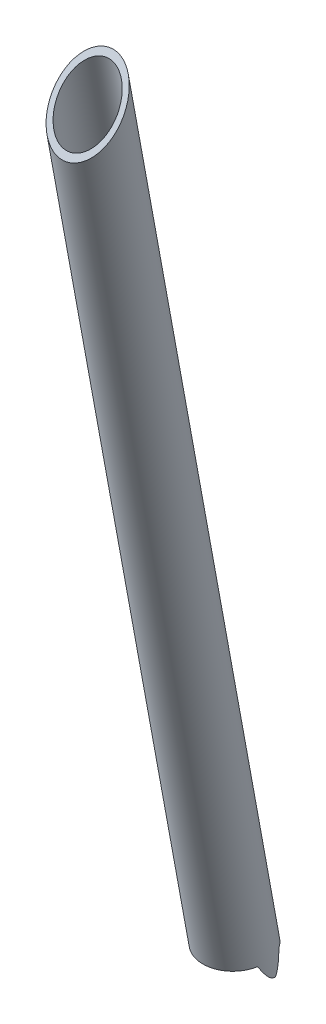
ISO-10303-21;
HEADER;
FILE_DESCRIPTION(('STEP AP214'),'2;1');
FILE_NAME('part.step','',(''),(''),'','','');
FILE_SCHEMA(('AUTOMOTIVE_DESIGN { 1 0 10303 214 1 1 1 1 }'));
ENDSEC;
DATA;
#1=APPLICATION_CONTEXT('core data for automotive mechanical design processes');
#2=APPLICATION_PROTOCOL_DEFINITION('international standard','automotive_design',2000,#1);
#3=PRODUCT_CONTEXT('',#1,'mechanical');
#4=PRODUCT('Part','Part','',(#3));
#5=PRODUCT_RELATED_PRODUCT_CATEGORY('part','',(#4));
#6=PRODUCT_DEFINITION_FORMATION('','',#4);
#7=PRODUCT_DEFINITION_CONTEXT('part definition',#1,'design');
#8=PRODUCT_DEFINITION('design','',#6,#7);
#9=PRODUCT_DEFINITION_SHAPE('','',#8);
#10=(LENGTH_UNIT() NAMED_UNIT(*) SI_UNIT(.MILLI.,.METRE.));
#11=(NAMED_UNIT(*) PLANE_ANGLE_UNIT() SI_UNIT($,.RADIAN.));
#12=(NAMED_UNIT(*) SI_UNIT($,.STERADIAN.) SOLID_ANGLE_UNIT());
#13=UNCERTAINTY_MEASURE_WITH_UNIT(LENGTH_MEASURE(1.E-05),#10,'distance_accuracy_value','');
#14=(GEOMETRIC_REPRESENTATION_CONTEXT(3) GLOBAL_UNCERTAINTY_ASSIGNED_CONTEXT((#13)) GLOBAL_UNIT_ASSIGNED_CONTEXT((#10,
#11,#12)) REPRESENTATION_CONTEXT('',''));
#15=CARTESIAN_POINT('',(0.,0.,0.));
#16=DIRECTION('',(0.,0.,1.));
#17=DIRECTION('',(1.,0.,0.));
#18=AXIS2_PLACEMENT_3D('',#15,#16,#17);
#19=CARTESIAN_POINT('',(325.,320.,-1580.));
#20=DIRECTION('',(-0.214351342090107,-0.914565726251124,-0.342962147344171));
#21=DIRECTION('',(0.,0.351123441588391,-0.936329177569045));
#22=AXIS2_PLACEMENT_3D('',#19,#20,#21);
#23=CYLINDRICAL_SURFACE('',#22,7.90000000000002);
#24=CARTESIAN_POINT('',(252.34375,10.,-1696.25));
#25=DIRECTION('',(0.,-1.,0.));
#26=DIRECTION('',(-0.52999894000318,0.,-0.847998304005088));
#27=AXIS2_PLACEMENT_3D('',#24,#25,#26);
#28=ELLIPSE('',#27,8.63797950572971,7.90000000000002);
#29=CARTESIAN_POINT('',(247.765630018194,10.,-1703.57499197089));
#30=VERTEX_POINT('',#29);
#31=EDGE_CURVE('E84',#30,#30,#28,.T.);
#32=ORIENTED_EDGE('',*,*,#31,.T.);
#33=EDGE_LOOP('',(#32));
#34=FACE_BOUND('',#33,.T.);
#35=CARTESIAN_POINT('',(325.,320.,-1580.));
#36=DIRECTION('',(0.00416950723616233,0.393939167319851,0.919127057408686));
#37=DIRECTION('',(-0.2871987901008,-0.87994037819309,0.37844654284329));
#38=AXIS2_PLACEMENT_3D('',#35,#36,#37);
#39=ELLIPSE('',#38,11.6794314327941,7.90000000000002);
#40=CARTESIAN_POINT('',(321.645681423436,309.722796687947,-1575.57995955188));
#41=VERTEX_POINT('',#40);
#42=EDGE_CURVE('E43',#41,#41,#39,.T.);
#43=ORIENTED_EDGE('',*,*,#42,.T.);
#44=EDGE_LOOP('',(#43));
#45=FACE_BOUND('',#44,.T.);
#46=ADVANCED_FACE('F39',(#34,#45),#23,.F.);
#47=CARTESIAN_POINT('',(325.,320.,-1580.));
#48=DIRECTION('',(-0.214351342090107,-0.914565726251124,-0.342962147344171));
#49=DIRECTION('',(0.,0.351123441588391,-0.936329177569045));
#50=AXIS2_PLACEMENT_3D('',#47,#48,#49);
#51=CYLINDRICAL_SURFACE('',#50,9.49999999999999);
#52=CARTESIAN_POINT('',(258.509137658845,36.3056540110711,-1686.38537974585));
#53=DIRECTION('',(-0.993532672656404,0.,-0.113546591160732));
#54=DIRECTION('',(0.03712393124551,-0.945042024116468,-0.324834398398211));
#55=AXIS2_PLACEMENT_3D('',#52,#53,#54);
#56=ELLIPSE('',#55,37.712293737374,9.49999999999999);
#57=CARTESIAN_POINT('',(260.240282329124,10.,-1701.53289561079));
#58=VERTEX_POINT('',#57);
#59=CARTESIAN_POINT('',(260.141225962762,3.01994811422281,-1700.66615240513));
#60=VERTEX_POINT('',#59);
#61=EDGE_CURVE('E78',#58,#60,#56,.T.);
#62=ORIENTED_EDGE('',*,*,#61,.F.);
#63=CARTESIAN_POINT('',(252.34375,10.,-1696.25));
#64=DIRECTION('',(0.,-1.,0.));
#65=DIRECTION('',(-0.52999894000318,0.,-0.847998304005088));
#66=AXIS2_PLACEMENT_3D('',#63,#64,#65);
#67=ELLIPSE('',#66,10.3874437094218,9.49999999999999);
#68=CARTESIAN_POINT('',(261.924194176926,10.,-1693.53427954847));
#69=VERTEX_POINT('',#68);
#70=EDGE_CURVE('E68',#69,#58,#67,.T.);
#71=ORIENTED_EDGE('',*,*,#70,.F.);
#72=CARTESIAN_POINT('',(267.179606773407,73.2996555665376,-1672.51262916255));
#73=DIRECTION('',(-0.970142500145332,0.,0.242535625036333));
#74=DIRECTION('',(-0.0940407512885348,-0.921768805422756,-0.376163005154139));
#75=AXIS2_PLACEMENT_3D('',#72,#73,#74);
#76=ELLIPSE('',#75,76.1396046117398,9.49999999999999);
#77=EDGE_CURVE('E48',#60,#69,#76,.T.);
#78=ORIENTED_EDGE('',*,*,#77,.F.);
#79=EDGE_LOOP('',(#62,#71,#78));
#80=FACE_BOUND('',#79,.T.);
#81=CARTESIAN_POINT('',(325.,320.,-1580.));
#82=DIRECTION('',(0.00416950723616233,0.393939167319851,0.919127057408686));
#83=DIRECTION('',(-0.2871987901008,-0.87994037819309,0.37844654284329));
#84=AXIS2_PLACEMENT_3D('',#81,#82,#83);
#85=ELLIPSE('',#84,14.0448859001954,9.49999999999999);
#86=CARTESIAN_POINT('',(320.96632576236,307.641337789304,-1574.68476148644));
#87=VERTEX_POINT('',#86);
#88=EDGE_CURVE('E11',#87,#87,#85,.T.);
#89=ORIENTED_EDGE('',*,*,#88,.F.);
#90=EDGE_LOOP('',(#89));
#91=FACE_BOUND('',#90,.T.);
#92=ADVANCED_FACE('F80',(#80,#91),#51,.T.);
#93=CARTESIAN_POINT('',(259.935326726564,10.,-1698.86453408839));
#94=DIRECTION('',(-0.993532672656404,0.,-0.113546591160732));
#95=DIRECTION('',(-0.113546591160732,0.,0.993532672656404));
#96=AXIS2_PLACEMENT_3D('',#93,#94,#95);
#97=PLANE('',#96);
#98=ORIENTED_EDGE('',*,*,#61,.T.);
#99=DIRECTION('',(0.,1.,0.));
#100=VECTOR('',#99,1.);
#101=CARTESIAN_POINT('',(260.141225962762,10.,-1700.66615240513));
#102=LINE('',#101,#100);
#103=CARTESIAN_POINT('',(260.141225962762,10.,-1700.66615240513));
#104=VERTEX_POINT('',#103);
#105=EDGE_CURVE('E56',#60,#104,#102,.T.);
#106=ORIENTED_EDGE('',*,*,#105,.T.);
#107=DIRECTION('',(-0.113546591160732,0.,0.993532672656404));
#108=VECTOR('',#107,1.);
#109=CARTESIAN_POINT('',(259.935326726564,10.,-1698.86453408839));
#110=LINE('',#109,#108);
#111=EDGE_CURVE('E71',#58,#104,#110,.T.);
#112=ORIENTED_EDGE('',*,*,#111,.F.);
#113=EDGE_LOOP('',(#98,#106,#112));
#114=FACE_BOUND('',#113,.T.);
#115=ADVANCED_FACE('F77',(#114),#97,.T.);
#116=CARTESIAN_POINT('',(259.935326726564,10.,-1698.86453408839));
#117=DIRECTION('',(0.,-1.,0.));
#118=DIRECTION('',(0.,0.,-1.));
#119=AXIS2_PLACEMENT_3D('',#116,#117,#118);
#120=PLANE('',#119);
#121=ORIENTED_EDGE('',*,*,#31,.F.);
#122=EDGE_LOOP('',(#121));
#123=FACE_BOUND('',#122,.T.);
#124=ORIENTED_EDGE('',*,*,#70,.T.);
#125=ORIENTED_EDGE('',*,*,#111,.T.);
#126=DIRECTION('',(0.242535625036333,0.,0.970142500145332));
#127=VECTOR('',#126,1.);
#128=CARTESIAN_POINT('',(184.701425001453,10.,-2002.42535625036));
#129=LINE('',#128,#127);
#130=EDGE_CURVE('E72',#104,#69,#129,.T.);
#131=ORIENTED_EDGE('',*,*,#130,.T.);
#132=EDGE_LOOP('',(#124,#125,#131));
#133=FACE_BOUND('',#132,.T.);
#134=ADVANCED_FACE('F70',(#123,#133),#120,.T.);
#135=CARTESIAN_POINT('',(184.701425001453,10.,-2002.42535625036));
#136=DIRECTION('',(-0.970142500145332,0.,0.242535625036333));
#137=DIRECTION('',(0.242535625036333,0.,0.970142500145332));
#138=AXIS2_PLACEMENT_3D('',#135,#136,#137);
#139=PLANE('',#138);
#140=ORIENTED_EDGE('',*,*,#77,.T.);
#141=ORIENTED_EDGE('',*,*,#130,.F.);
#142=ORIENTED_EDGE('',*,*,#105,.F.);
#143=EDGE_LOOP('',(#140,#141,#142));
#144=FACE_BOUND('',#143,.T.);
#145=ADVANCED_FACE('F94',(#144),#139,.T.);
#146=CARTESIAN_POINT('',(325.,320.,-1580.));
#147=DIRECTION('',(0.00416950723616233,0.393939167319851,0.919127057408686));
#148=DIRECTION('',(0.,-0.919135046928569,0.393942591639465));
#149=AXIS2_PLACEMENT_3D('',#146,#147,#148);
#150=PLANE('',#149);
#151=ORIENTED_EDGE('',*,*,#42,.F.);
#152=EDGE_LOOP('',(#151));
#153=FACE_BOUND('',#152,.T.);
#154=ORIENTED_EDGE('',*,*,#88,.T.);
#155=EDGE_LOOP('',(#154));
#156=FACE_BOUND('',#155,.T.);
#157=ADVANCED_FACE('F41',(#153,#156),#150,.T.);
#158=CLOSED_SHELL('',(#46,#92,#115,#134,#145,#157));
#159=MANIFOLD_SOLID_BREP('B2',#158);
#160=ADVANCED_BREP_SHAPE_REPRESENTATION('',(#18,#159),#14);
#161=SHAPE_DEFINITION_REPRESENTATION(#9,#160);
ENDSEC;
END-ISO-10303-21;
